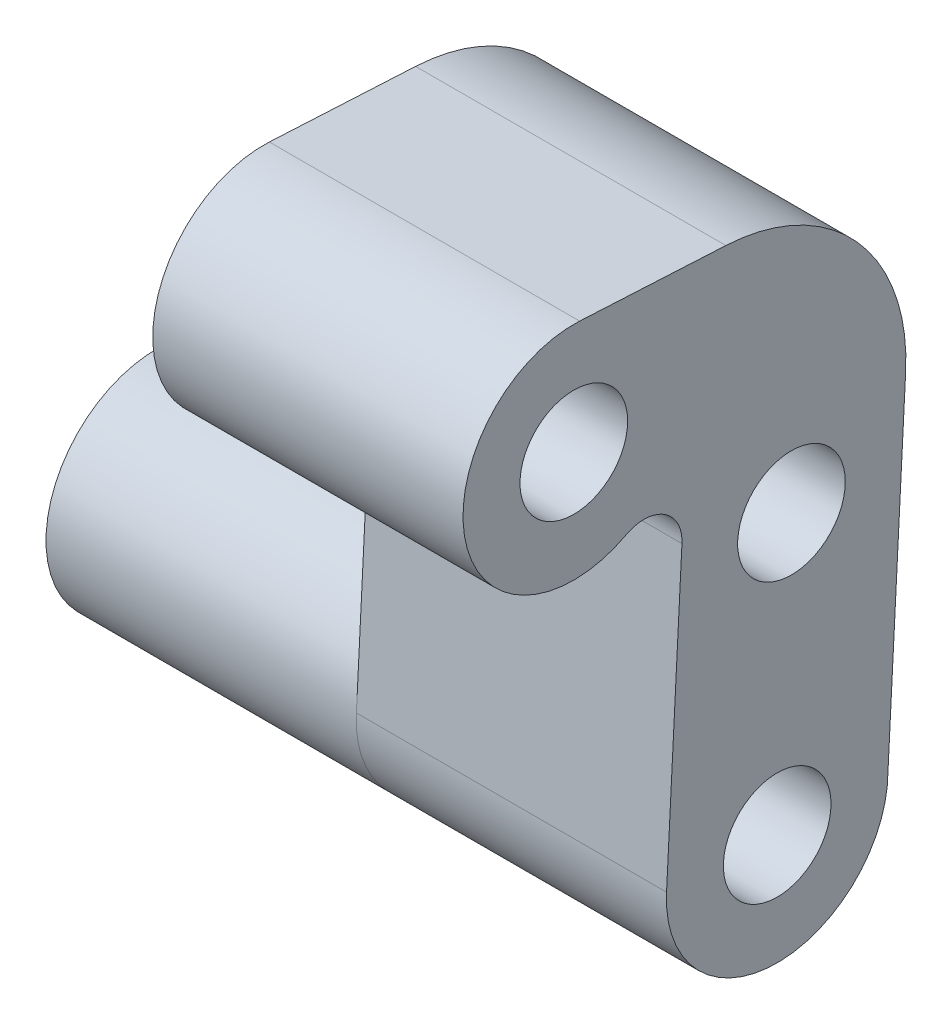
ISO-10303-21;
HEADER;
FILE_DESCRIPTION(('STEP AP214'),'2;1');
FILE_NAME('part.step','',(''),(''),'','','');
FILE_SCHEMA(('AUTOMOTIVE_DESIGN { 1 0 10303 214 1 1 1 1 }'));
ENDSEC;
DATA;
#1=APPLICATION_CONTEXT('core data for automotive mechanical design processes');
#2=APPLICATION_PROTOCOL_DEFINITION('international standard','automotive_design',2000,#1);
#3=PRODUCT_CONTEXT('',#1,'mechanical');
#4=PRODUCT('Part','Part','',(#3));
#5=PRODUCT_RELATED_PRODUCT_CATEGORY('part','',(#4));
#6=PRODUCT_DEFINITION_FORMATION('','',#4);
#7=PRODUCT_DEFINITION_CONTEXT('part definition',#1,'design');
#8=PRODUCT_DEFINITION('design','',#6,#7);
#9=PRODUCT_DEFINITION_SHAPE('','',#8);
#10=(LENGTH_UNIT() NAMED_UNIT(*) SI_UNIT(.MILLI.,.METRE.));
#11=(NAMED_UNIT(*) PLANE_ANGLE_UNIT() SI_UNIT($,.RADIAN.));
#12=(NAMED_UNIT(*) SI_UNIT($,.STERADIAN.) SOLID_ANGLE_UNIT());
#13=UNCERTAINTY_MEASURE_WITH_UNIT(LENGTH_MEASURE(1.E-05),#10,'distance_accuracy_value','');
#14=(GEOMETRIC_REPRESENTATION_CONTEXT(3) GLOBAL_UNCERTAINTY_ASSIGNED_CONTEXT((#13)) GLOBAL_UNIT_ASSIGNED_CONTEXT((#10,
#11,#12)) REPRESENTATION_CONTEXT('',''));
#15=CARTESIAN_POINT('',(0.,0.,0.));
#16=DIRECTION('',(0.,0.,1.));
#17=DIRECTION('',(1.,0.,0.));
#18=AXIS2_PLACEMENT_3D('',#15,#16,#17);
#19=CARTESIAN_POINT('',(19.8,9.53843032103774,21.8711746408145));
#20=DIRECTION('',(1.,0.,0.));
#21=DIRECTION('',(0.,0.,-1.));
#22=AXIS2_PLACEMENT_3D('',#19,#20,#21);
#23=PLANE('',#22);
#24=CARTESIAN_POINT('',(19.8,0.,17.6646125655959));
#25=DIRECTION('',(1.,0.,0.));
#26=DIRECTION('',(0.,0.,-1.));
#27=AXIS2_PLACEMENT_3D('',#24,#25,#26);
#28=CIRCLE('',#27,1.70000000000002);
#29=CARTESIAN_POINT('',(19.8,0.,15.9646125655958));
#30=VERTEX_POINT('',#29);
#31=EDGE_CURVE('E237',#30,#30,#28,.T.);
#32=ORIENTED_EDGE('',*,*,#31,.F.);
#33=EDGE_LOOP('',(#32));
#34=FACE_BOUND('',#33,.T.);
#35=CARTESIAN_POINT('',(19.8,9.53843032103774,21.8711746408145));
#36=DIRECTION('',(1.,0.,0.));
#37=DIRECTION('',(0.,0.,-1.));
#38=AXIS2_PLACEMENT_3D('',#35,#36,#37);
#39=CIRCLE('',#38,1.2);
#40=CARTESIAN_POINT('',(19.8,9.47562717354621,20.6728191991091));
#41=VERTEX_POINT('',#40);
#42=CARTESIAN_POINT('',(19.8,10.5964552344458,22.4373753849043));
#43=VERTEX_POINT('',#42);
#44=EDGE_CURVE('E248',#41,#43,#39,.T.);
#45=ORIENTED_EDGE('',*,*,#44,.F.);
#46=DIRECTION('',(0.,0.998629534754574,-0.0523359562429369));
#47=VECTOR('',#46,1.);
#48=CARTESIAN_POINT('',(19.8,1.10640324970027,21.1114316392803));
#49=LINE('',#48,#47);
#50=CARTESIAN_POINT('',(19.8,0.183175846850278,21.1598159372369));
#51=VERTEX_POINT('',#50);
#52=EDGE_CURVE('E118',#51,#41,#49,.T.);
#53=ORIENTED_EDGE('',*,*,#52,.F.);
#54=CARTESIAN_POINT('',(19.8,0.,17.6646125655959));
#55=DIRECTION('',(1.,0.,0.));
#56=DIRECTION('',(0.,0.,-1.));
#57=AXIS2_PLACEMENT_3D('',#54,#55,#56);
#58=CIRCLE('',#57,3.5);
#59=CARTESIAN_POINT('',(19.8,0.,14.1646125655959));
#60=VERTEX_POINT('',#59);
#61=EDGE_CURVE('E112',#51,#60,#58,.T.);
#62=ORIENTED_EDGE('',*,*,#61,.T.);
#63=DIRECTION('',(0.,0.998629534754574,-0.0523359562429354));
#64=VECTOR('',#63,1.);
#65=CARTESIAN_POINT('',(19.8,0.740302592131596,14.1258149507448));
#66=LINE('',#65,#64);
#67=CARTESIAN_POINT('',(19.8,10.6296309629233,13.6075372122309));
#68=VERTEX_POINT('',#67);
#69=EDGE_CURVE('E116',#60,#68,#66,.T.);
#70=ORIENTED_EDGE('',*,*,#69,.T.);
#71=CARTESIAN_POINT('',(19.8,10.9436467003809,19.5993144207583));
#72=DIRECTION('',(1.,0.,0.));
#73=DIRECTION('',(0.,0.,-1.));
#74=AXIS2_PLACEMENT_3D('',#71,#72,#73);
#75=CIRCLE('',#74,6.);
#76=CARTESIAN_POINT('',(19.8,16.9354239089084,19.2852986833007));
#77=VERTEX_POINT('',#76);
#78=EDGE_CURVE('E134',#68,#77,#75,.T.);
#79=ORIENTED_EDGE('',*,*,#78,.T.);
#80=DIRECTION('',(0.,0.0523359562429433,0.998629534754574));
#81=VECTOR('',#80,1.);
#82=CARTESIAN_POINT('',(19.8,15.881105579319,-0.832293475971615));
#83=LINE('',#82,#81);
#84=CARTESIAN_POINT('',(19.8,17.1775646035271,23.9056183749825));
#85=VERTEX_POINT('',#84);
#86=EDGE_CURVE('E136',#77,#85,#83,.T.);
#87=ORIENTED_EDGE('',*,*,#86,.T.);
#88=CARTESIAN_POINT('',(19.8,13.6823612318861,24.0887942218328));
#89=DIRECTION('',(1.,0.,0.));
#90=DIRECTION('',(0.,0.,-1.));
#91=AXIS2_PLACEMENT_3D('',#88,#89,#90);
#92=CIRCLE('',#91,3.5);
#93=EDGE_CURVE('E99',#85,#43,#92,.T.);
#94=ORIENTED_EDGE('',*,*,#93,.T.);
#95=EDGE_LOOP('',(#45,#53,#62,#70,#79,#87,#94));
#96=FACE_BOUND('',#95,.T.);
#97=CARTESIAN_POINT('',(19.8,8.58821399888934,17.2145233419066));
#98=DIRECTION('',(1.,0.,0.));
#99=DIRECTION('',(0.,0.,-1.));
#100=AXIS2_PLACEMENT_3D('',#97,#98,#99);
#101=CIRCLE('',#100,1.7);
#102=CARTESIAN_POINT('',(19.8,8.58821399888934,15.5145233419066));
#103=VERTEX_POINT('',#102);
#104=EDGE_CURVE('E146',#103,#103,#101,.T.);
#105=ORIENTED_EDGE('',*,*,#104,.F.);
#106=EDGE_LOOP('',(#105));
#107=FACE_BOUND('',#106,.T.);
#108=CARTESIAN_POINT('',(19.8,13.6823612318861,24.0887942218328));
#109=DIRECTION('',(1.,0.,0.));
#110=DIRECTION('',(0.,0.,-1.));
#111=AXIS2_PLACEMENT_3D('',#108,#109,#110);
#112=CIRCLE('',#111,1.7);
#113=CARTESIAN_POINT('',(19.8,13.6823612318861,22.3887942218328));
#114=VERTEX_POINT('',#113);
#115=EDGE_CURVE('E234',#114,#114,#112,.T.);
#116=ORIENTED_EDGE('',*,*,#115,.F.);
#117=EDGE_LOOP('',(#116));
#118=FACE_BOUND('',#117,.T.);
#119=ADVANCED_FACE('F43',(#34,#96,#107,#118),#23,.T.);
#120=CARTESIAN_POINT('',(10.,9.53843032103774,21.8711746408145));
#121=DIRECTION('',(1.,0.,0.));
#122=DIRECTION('',(0.,0.,-1.));
#123=AXIS2_PLACEMENT_3D('',#120,#121,#122);
#124=PLANE('',#123);
#125=DIRECTION('',(0.,0.998629534754574,-0.0523359562429354));
#126=VECTOR('',#125,1.);
#127=CARTESIAN_POINT('',(10.,0.740302592131596,14.1258149507448));
#128=LINE('',#127,#126);
#129=CARTESIAN_POINT('',(10.,0.,14.1670108797754));
#130=VERTEX_POINT('',#129);
#131=CARTESIAN_POINT('',(10.,10.6296309629233,13.6075372122309));
#132=VERTEX_POINT('',#131);
#133=EDGE_CURVE('E152',#130,#132,#128,.T.);
#134=ORIENTED_EDGE('',*,*,#133,.F.);
#135=CARTESIAN_POINT('',(10.,0.,14.1694091939549));
#136=CARTESIAN_POINT('',(10.,0.694849137765244,14.1694091939549));
#137=CARTESIAN_POINT('',(10.,1.33755642307362,14.4354657085723));
#138=CARTESIAN_POINT('',(10.,1.97923775857886,14.7010975187636));
#139=CARTESIAN_POINT('',(10.,2.47148200571344,15.1931305598824));
#140=CARTESIAN_POINT('',(10.,2.96266536511088,15.6841031684566));
#141=CARTESIAN_POINT('',(10.,3.22914685702357,16.3270561425222));
#142=CARTESIAN_POINT('',(10.,3.49505402643526,16.9686234205028));
#143=CARTESIAN_POINT('',(10.,3.49520337164101,17.6646125655959));
#144=CARTESIAN_POINT('',(10.,3.49535239497708,18.3591017107331));
#145=CARTESIAN_POINT('',(10.,3.22914685702357,19.0021689886695));
#146=CARTESIAN_POINT('',(10.,2.96351504683228,19.6438503241751));
#147=CARTESIAN_POINT('',(10.,2.47148200571344,20.1360945713093));
#148=CARTESIAN_POINT('',(10.,1.9805093971383,20.6272779307073));
#149=CARTESIAN_POINT('',(10.,1.33755642307362,20.8937594226194));
#150=CARTESIAN_POINT('',(10.,0.782752530708305,21.1237062070965));
#151=CARTESIAN_POINT('',(10.,0.187251110841564,21.1549151140662));
#152=B_SPLINE_CURVE_WITH_KNOTS('',2,(#135,#136,#137,#138,#139,#140,#141,#142,#143,#144,#145,
#146,#147,#148,#149,#150,#151),.UNSPECIFIED.,.F.,.F.,(3,2,2,2,2,2,2,2,3),(0.,0.0625,0.125,
0.1875,0.25,0.3125,0.375,0.4375,0.491547711694248),.UNSPECIFIED.);
#153=CARTESIAN_POINT('',(10.,0.184541700963939,21.1563614125461));
#154=VERTEX_POINT('',#153);
#155=EDGE_CURVE('E86',#130,#154,#152,.T.);
#156=ORIENTED_EDGE('',*,*,#155,.T.);
#157=DIRECTION('',(0.,0.998629534754574,-0.0523359562429369));
#158=VECTOR('',#157,1.);
#159=CARTESIAN_POINT('',(10.,1.10640324970027,21.1114316392803));
#160=LINE('',#159,#158);
#161=CARTESIAN_POINT('',(10.,9.47562717354621,20.6728191991091));
#162=VERTEX_POINT('',#161);
#163=EDGE_CURVE('E250',#154,#162,#160,.T.);
#164=ORIENTED_EDGE('',*,*,#163,.T.);
#165=CARTESIAN_POINT('',(10.,9.53843032103774,21.8711746408145));
#166=DIRECTION('',(1.,0.,0.));
#167=DIRECTION('',(0.,0.,-1.));
#168=AXIS2_PLACEMENT_3D('',#165,#166,#167);
#169=CIRCLE('',#168,1.2);
#170=CARTESIAN_POINT('',(10.,10.5964552344458,22.4373753849043));
#171=VERTEX_POINT('',#170);
#172=EDGE_CURVE('E142',#162,#171,#169,.T.);
#173=ORIENTED_EDGE('',*,*,#172,.T.);
#174=CARTESIAN_POINT('',(10.,13.6823612318861,24.0887942218328));
#175=DIRECTION('',(1.,0.,0.));
#176=DIRECTION('',(0.,0.,-1.));
#177=AXIS2_PLACEMENT_3D('',#174,#175,#176);
#178=CIRCLE('',#177,3.5);
#179=CARTESIAN_POINT('',(10.,17.1775646035271,23.9056183749825));
#180=VERTEX_POINT('',#179);
#181=EDGE_CURVE('E145',#180,#171,#178,.T.);
#182=ORIENTED_EDGE('',*,*,#181,.F.);
#183=DIRECTION('',(0.,0.0523359562429433,0.998629534754574));
#184=VECTOR('',#183,1.);
#185=CARTESIAN_POINT('',(10.,15.881105579319,-0.832293475971615));
#186=LINE('',#185,#184);
#187=CARTESIAN_POINT('',(10.,16.9354239089084,19.2852986833007));
#188=VERTEX_POINT('',#187);
#189=EDGE_CURVE('E149',#188,#180,#186,.T.);
#190=ORIENTED_EDGE('',*,*,#189,.F.);
#191=CARTESIAN_POINT('',(10.,10.9436467003809,19.5993144207583));
#192=DIRECTION('',(1.,0.,0.));
#193=DIRECTION('',(0.,0.,-1.));
#194=AXIS2_PLACEMENT_3D('',#191,#192,#193);
#195=CIRCLE('',#194,6.);
#196=EDGE_CURVE('E151',#132,#188,#195,.T.);
#197=ORIENTED_EDGE('',*,*,#196,.F.);
#198=EDGE_LOOP('',(#134,#156,#164,#173,#182,#190,#197));
#199=FACE_BOUND('',#198,.T.);
#200=CARTESIAN_POINT('',(10.,8.58821399888934,17.2145233419066));
#201=DIRECTION('',(1.,0.,0.));
#202=DIRECTION('',(0.,0.,-1.));
#203=AXIS2_PLACEMENT_3D('',#200,#201,#202);
#204=CIRCLE('',#203,1.7);
#205=CARTESIAN_POINT('',(10.,8.58821399888934,15.5145233419066));
#206=VERTEX_POINT('',#205);
#207=EDGE_CURVE('E243',#206,#206,#204,.T.);
#208=ORIENTED_EDGE('',*,*,#207,.T.);
#209=EDGE_LOOP('',(#208));
#210=FACE_BOUND('',#209,.T.);
#211=CARTESIAN_POINT('',(10.,13.6823612318861,24.0887942218328));
#212=DIRECTION('',(1.,0.,0.));
#213=DIRECTION('',(0.,0.,-1.));
#214=AXIS2_PLACEMENT_3D('',#211,#212,#213);
#215=CIRCLE('',#214,1.7);
#216=CARTESIAN_POINT('',(10.,13.6823612318861,22.3887942218328));
#217=VERTEX_POINT('',#216);
#218=EDGE_CURVE('E238',#217,#217,#215,.T.);
#219=ORIENTED_EDGE('',*,*,#218,.T.);
#220=EDGE_LOOP('',(#219));
#221=FACE_BOUND('',#220,.T.);
#222=ADVANCED_FACE('F198',(#199,#210,#221),#124,.F.);
#223=CARTESIAN_POINT('',(19.8,9.53843032103774,21.8711746408145));
#224=DIRECTION('',(-1.,0.,0.));
#225=DIRECTION('',(0.,0.,1.));
#226=AXIS2_PLACEMENT_3D('',#223,#224,#225);
#227=CYLINDRICAL_SURFACE('',#226,1.2);
#228=ORIENTED_EDGE('',*,*,#172,.F.);
#229=DIRECTION('',(-1.,0.,0.));
#230=VECTOR('',#229,1.);
#231=CARTESIAN_POINT('',(19.8,9.47562717354621,20.6728191991091));
#232=LINE('',#231,#230);
#233=EDGE_CURVE('E11',#41,#162,#232,.T.);
#234=ORIENTED_EDGE('',*,*,#233,.F.);
#235=ORIENTED_EDGE('',*,*,#44,.T.);
#236=DIRECTION('',(-1.,0.,0.));
#237=VECTOR('',#236,1.);
#238=CARTESIAN_POINT('',(19.8,10.5964552344458,22.4373753849043));
#239=LINE('',#238,#237);
#240=EDGE_CURVE('E141',#43,#171,#239,.T.);
#241=ORIENTED_EDGE('',*,*,#240,.T.);
#242=EDGE_LOOP('',(#228,#234,#235,#241));
#243=FACE_BOUND('',#242,.T.);
#244=ADVANCED_FACE('F45',(#243),#227,.F.);
#245=CARTESIAN_POINT('',(19.8,1.10640324970027,21.1114316392803));
#246=DIRECTION('',(0.,0.0523359562429369,0.998629534754574));
#247=DIRECTION('',(0.,-0.998629534754574,0.0523359562429369));
#248=AXIS2_PLACEMENT_3D('',#245,#246,#247);
#249=PLANE('',#248);
#250=ORIENTED_EDGE('',*,*,#163,.F.);
#251=DIRECTION('',(-1.,0.,0.));
#252=VECTOR('',#251,1.);
#253=CARTESIAN_POINT('',(19.8,0.183175846850278,21.1598159372369));
#254=LINE('',#253,#252);
#255=EDGE_CURVE('E55',#51,#154,#254,.T.);
#256=ORIENTED_EDGE('',*,*,#255,.F.);
#257=ORIENTED_EDGE('',*,*,#52,.T.);
#258=ORIENTED_EDGE('',*,*,#233,.T.);
#259=EDGE_LOOP('',(#250,#256,#257,#258));
#260=FACE_BOUND('',#259,.T.);
#261=ADVANCED_FACE('F176',(#260),#249,.T.);
#262=CARTESIAN_POINT('',(19.8,0.,17.6646125655959));
#263=DIRECTION('',(-1.,0.,0.));
#264=DIRECTION('',(0.,0.,1.));
#265=AXIS2_PLACEMENT_3D('',#262,#263,#264);
#266=CYLINDRICAL_SURFACE('',#265,3.5);
#267=CARTESIAN_POINT('',(10.,0.,17.6646125655959));
#268=DIRECTION('',(1.,0.,0.));
#269=DIRECTION('',(0.,0.0523359562429368,0.998629534754574));
#270=AXIS2_PLACEMENT_3D('',#267,#268,#269);
#271=CIRCLE('',#270,3.5);
#272=EDGE_CURVE('E125',#154,#130,#271,.T.);
#273=ORIENTED_EDGE('',*,*,#272,.T.);
#274=DIRECTION('',(-1.,0.,0.));
#275=VECTOR('',#274,1.);
#276=CARTESIAN_POINT('',(19.8,0.,14.1646125655959));
#277=LINE('',#276,#275);
#278=EDGE_CURVE('E123',#60,#130,#277,.T.);
#279=ORIENTED_EDGE('',*,*,#278,.F.);
#280=ORIENTED_EDGE('',*,*,#61,.F.);
#281=ORIENTED_EDGE('',*,*,#255,.T.);
#282=EDGE_LOOP('',(#273,#279,#280,#281));
#283=FACE_BOUND('',#282,.T.);
#284=ADVANCED_FACE('F124',(#283),#266,.T.);
#285=CARTESIAN_POINT('',(19.8,0.740302592131596,14.1258149507448));
#286=DIRECTION('',(0.,0.0523359562429354,0.998629534754574));
#287=DIRECTION('',(0.,-0.998629534754574,0.0523359562429354));
#288=AXIS2_PLACEMENT_3D('',#285,#286,#287);
#289=PLANE('',#288);
#290=ORIENTED_EDGE('',*,*,#133,.T.);
#291=DIRECTION('',(-1.,0.,0.));
#292=VECTOR('',#291,1.);
#293=CARTESIAN_POINT('',(19.8,10.6296309629233,13.6075372122309));
#294=LINE('',#293,#292);
#295=EDGE_CURVE('E129',#68,#132,#294,.T.);
#296=ORIENTED_EDGE('',*,*,#295,.F.);
#297=ORIENTED_EDGE('',*,*,#69,.F.);
#298=ORIENTED_EDGE('',*,*,#278,.T.);
#299=EDGE_LOOP('',(#290,#296,#297,#298));
#300=FACE_BOUND('',#299,.T.);
#301=ADVANCED_FACE('F131',(#300),#289,.F.);
#302=CARTESIAN_POINT('',(19.8,10.9436467003809,19.5993144207583));
#303=DIRECTION('',(-1.,0.,0.));
#304=DIRECTION('',(0.,0.,1.));
#305=AXIS2_PLACEMENT_3D('',#302,#303,#304);
#306=CYLINDRICAL_SURFACE('',#305,6.);
#307=ORIENTED_EDGE('',*,*,#196,.T.);
#308=DIRECTION('',(-1.,0.,0.));
#309=VECTOR('',#308,1.);
#310=CARTESIAN_POINT('',(19.8,16.9354239089084,19.2852986833007));
#311=LINE('',#310,#309);
#312=EDGE_CURVE('E155',#77,#188,#311,.T.);
#313=ORIENTED_EDGE('',*,*,#312,.F.);
#314=ORIENTED_EDGE('',*,*,#78,.F.);
#315=ORIENTED_EDGE('',*,*,#295,.T.);
#316=EDGE_LOOP('',(#307,#313,#314,#315));
#317=FACE_BOUND('',#316,.T.);
#318=ADVANCED_FACE('F179',(#317),#306,.T.);
#319=CARTESIAN_POINT('',(19.8,15.881105579319,-0.832293475971615));
#320=DIRECTION('',(0.,-0.998629534754574,0.0523359562429433));
#321=DIRECTION('',(0.,-0.0523359562429433,-0.998629534754574));
#322=AXIS2_PLACEMENT_3D('',#319,#320,#321);
#323=PLANE('',#322);
#324=ORIENTED_EDGE('',*,*,#189,.T.);
#325=DIRECTION('',(-1.,0.,0.));
#326=VECTOR('',#325,1.);
#327=CARTESIAN_POINT('',(19.8,17.1775646035271,23.9056183749825));
#328=LINE('',#327,#326);
#329=EDGE_CURVE('E158',#85,#180,#328,.T.);
#330=ORIENTED_EDGE('',*,*,#329,.F.);
#331=ORIENTED_EDGE('',*,*,#86,.F.);
#332=ORIENTED_EDGE('',*,*,#312,.T.);
#333=EDGE_LOOP('',(#324,#330,#331,#332));
#334=FACE_BOUND('',#333,.T.);
#335=ADVANCED_FACE('F182',(#334),#323,.F.);
#336=CARTESIAN_POINT('',(19.8,13.6823612318861,24.0887942218328));
#337=DIRECTION('',(-1.,0.,0.));
#338=DIRECTION('',(0.,0.,1.));
#339=AXIS2_PLACEMENT_3D('',#336,#337,#338);
#340=CYLINDRICAL_SURFACE('',#339,3.5);
#341=ORIENTED_EDGE('',*,*,#181,.T.);
#342=ORIENTED_EDGE('',*,*,#240,.F.);
#343=ORIENTED_EDGE('',*,*,#93,.F.);
#344=ORIENTED_EDGE('',*,*,#329,.T.);
#345=EDGE_LOOP('',(#341,#342,#343,#344));
#346=FACE_BOUND('',#345,.T.);
#347=ADVANCED_FACE('F185',(#346),#340,.T.);
#348=CARTESIAN_POINT('',(19.8,8.58821399888934,17.2145233419066));
#349=DIRECTION('',(-1.,0.,0.));
#350=DIRECTION('',(0.,0.,1.));
#351=AXIS2_PLACEMENT_3D('',#348,#349,#350);
#352=CYLINDRICAL_SURFACE('',#351,1.7);
#353=ORIENTED_EDGE('',*,*,#104,.T.);
#354=EDGE_LOOP('',(#353));
#355=FACE_BOUND('',#354,.T.);
#356=ORIENTED_EDGE('',*,*,#207,.F.);
#357=EDGE_LOOP('',(#356));
#358=FACE_BOUND('',#357,.T.);
#359=ADVANCED_FACE('F188',(#355,#358),#352,.F.);
#360=CARTESIAN_POINT('',(19.8,0.,17.6646125655959));
#361=DIRECTION('',(-1.,0.,0.));
#362=DIRECTION('',(0.,0.,1.));
#363=AXIS2_PLACEMENT_3D('',#360,#361,#362);
#364=CYLINDRICAL_SURFACE('',#363,1.70000000000002);
#365=ORIENTED_EDGE('',*,*,#31,.T.);
#366=EDGE_LOOP('',(#365));
#367=FACE_BOUND('',#366,.T.);
#368=CARTESIAN_POINT('',(0.2,0.,17.6646125655959));
#369=DIRECTION('',(1.,0.,0.));
#370=DIRECTION('',(0.,0.,-1.));
#371=AXIS2_PLACEMENT_3D('',#368,#369,#370);
#372=CIRCLE('',#371,1.70000000000002);
#373=CARTESIAN_POINT('',(0.2,0.,15.9646125655958));
#374=VERTEX_POINT('',#373);
#375=EDGE_CURVE('E270',#374,#374,#372,.T.);
#376=ORIENTED_EDGE('',*,*,#375,.F.);
#377=EDGE_LOOP('',(#376));
#378=FACE_BOUND('',#377,.T.);
#379=ADVANCED_FACE('F194',(#367,#378),#364,.F.);
#380=CARTESIAN_POINT('',(19.8,13.6823612318861,24.0887942218328));
#381=DIRECTION('',(-1.,0.,0.));
#382=DIRECTION('',(0.,0.,1.));
#383=AXIS2_PLACEMENT_3D('',#380,#381,#382);
#384=CYLINDRICAL_SURFACE('',#383,1.7);
#385=ORIENTED_EDGE('',*,*,#115,.T.);
#386=EDGE_LOOP('',(#385));
#387=FACE_BOUND('',#386,.T.);
#388=ORIENTED_EDGE('',*,*,#218,.F.);
#389=EDGE_LOOP('',(#388));
#390=FACE_BOUND('',#389,.T.);
#391=ADVANCED_FACE('F212',(#387,#390),#384,.F.);
#392=CARTESIAN_POINT('',(10.,0.,17.6646125655959));
#393=DIRECTION('',(-1.,0.,0.));
#394=DIRECTION('',(0.,0.,1.));
#395=AXIS2_PLACEMENT_3D('',#392,#393,#394);
#396=CYLINDRICAL_SURFACE('',#395,3.49520337164101);
#397=ORIENTED_EDGE('',*,*,#155,.F.);
#398=ORIENTED_EDGE('',*,*,#272,.F.);
#399=EDGE_LOOP('',(#397,#398));
#400=FACE_BOUND('',#399,.T.);
#401=CARTESIAN_POINT('',(0.2,0.,17.6646125655959));
#402=DIRECTION('',(1.,0.,0.));
#403=DIRECTION('',(0.,0.,-1.));
#404=AXIS2_PLACEMENT_3D('',#401,#402,#403);
#405=CIRCLE('',#404,3.49520337164101);
#406=CARTESIAN_POINT('',(0.2,0.,14.1694091939549));
#407=VERTEX_POINT('',#406);
#408=EDGE_CURVE('E268',#407,#407,#405,.T.);
#409=ORIENTED_EDGE('',*,*,#408,.T.);
#410=EDGE_LOOP('',(#409));
#411=FACE_BOUND('',#410,.T.);
#412=ADVANCED_FACE('F216',(#400,#411),#396,.T.);
#413=CARTESIAN_POINT('',(0.2,0.,0.));
#414=DIRECTION('',(1.,0.,0.));
#415=DIRECTION('',(0.,0.,-1.));
#416=AXIS2_PLACEMENT_3D('',#413,#414,#415);
#417=PLANE('',#416);
#418=ORIENTED_EDGE('',*,*,#375,.T.);
#419=EDGE_LOOP('',(#418));
#420=FACE_BOUND('',#419,.T.);
#421=ORIENTED_EDGE('',*,*,#408,.F.);
#422=EDGE_LOOP('',(#421));
#423=FACE_BOUND('',#422,.T.);
#424=ADVANCED_FACE('F221',(#420,#423),#417,.F.);
#425=CLOSED_SHELL('',(#119,#222,#244,#261,#284,#301,#318,#335,#347,#359,#379,#391,#412,#424));
#426=MANIFOLD_SOLID_BREP('B2',#425);
#427=ADVANCED_BREP_SHAPE_REPRESENTATION('',(#18,#426),#14);
#428=SHAPE_DEFINITION_REPRESENTATION(#9,#427);
ENDSEC;
END-ISO-10303-21;
